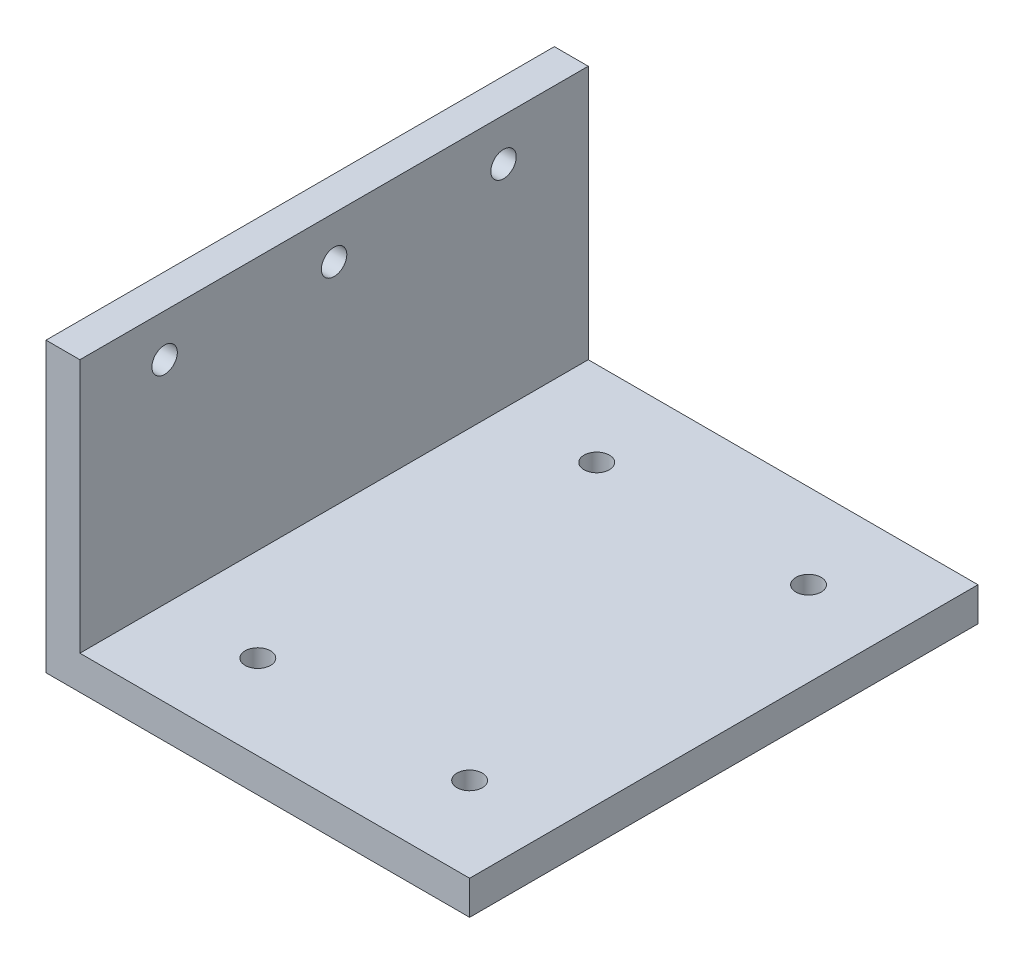
ISO-10303-21;
HEADER;
FILE_DESCRIPTION(('STEP AP214'),'2;1');
FILE_NAME('part.step','',(''),(''),'','','');
FILE_SCHEMA(('AUTOMOTIVE_DESIGN { 1 0 10303 214 1 1 1 1 }'));
ENDSEC;
DATA;
#1=APPLICATION_CONTEXT('core data for automotive mechanical design processes');
#2=APPLICATION_PROTOCOL_DEFINITION('international standard','automotive_design',2000,#1);
#3=PRODUCT_CONTEXT('',#1,'mechanical');
#4=PRODUCT('Part','Part','',(#3));
#5=PRODUCT_RELATED_PRODUCT_CATEGORY('part','',(#4));
#6=PRODUCT_DEFINITION_FORMATION('','',#4);
#7=PRODUCT_DEFINITION_CONTEXT('part definition',#1,'design');
#8=PRODUCT_DEFINITION('design','',#6,#7);
#9=PRODUCT_DEFINITION_SHAPE('','',#8);
#10=(LENGTH_UNIT() NAMED_UNIT(*) SI_UNIT(.MILLI.,.METRE.));
#11=(NAMED_UNIT(*) PLANE_ANGLE_UNIT() SI_UNIT($,.RADIAN.));
#12=(NAMED_UNIT(*) SI_UNIT($,.STERADIAN.) SOLID_ANGLE_UNIT());
#13=UNCERTAINTY_MEASURE_WITH_UNIT(LENGTH_MEASURE(1.E-05),#10,'distance_accuracy_value','');
#14=(GEOMETRIC_REPRESENTATION_CONTEXT(3) GLOBAL_UNCERTAINTY_ASSIGNED_CONTEXT((#13)) GLOBAL_UNIT_ASSIGNED_CONTEXT((#10,
#11,#12)) REPRESENTATION_CONTEXT('',''));
#15=CARTESIAN_POINT('',(0.,0.,0.));
#16=DIRECTION('',(0.,0.,1.));
#17=DIRECTION('',(1.,0.,0.));
#18=AXIS2_PLACEMENT_3D('',#15,#16,#17);
#19=CARTESIAN_POINT('',(0.,0.,60.));
#20=DIRECTION('',(1.,0.,0.));
#21=DIRECTION('',(0.,0.,-1.));
#22=AXIS2_PLACEMENT_3D('',#19,#20,#21);
#23=PLANE('',#22);
#24=CARTESIAN_POINT('',(0.,29.,30.));
#25=DIRECTION('',(-1.,0.,0.));
#26=DIRECTION('',(0.,0.,1.));
#27=AXIS2_PLACEMENT_3D('',#24,#25,#26);
#28=CIRCLE('',#27,1.5);
#29=CARTESIAN_POINT('',(0.,29.,31.5));
#30=VERTEX_POINT('',#29);
#31=EDGE_CURVE('E221',#30,#30,#28,.T.);
#32=ORIENTED_EDGE('',*,*,#31,.F.);
#33=EDGE_LOOP('',(#32));
#34=FACE_BOUND('',#33,.T.);
#35=CARTESIAN_POINT('',(0.,29.,50.));
#36=DIRECTION('',(-1.,0.,0.));
#37=DIRECTION('',(0.,0.,1.));
#38=AXIS2_PLACEMENT_3D('',#35,#36,#37);
#39=CIRCLE('',#38,1.5);
#40=CARTESIAN_POINT('',(0.,29.,51.5));
#41=VERTEX_POINT('',#40);
#42=EDGE_CURVE('E148',#41,#41,#39,.T.);
#43=ORIENTED_EDGE('',*,*,#42,.F.);
#44=EDGE_LOOP('',(#43));
#45=FACE_BOUND('',#44,.T.);
#46=DIRECTION('',(0.,-1.,0.));
#47=VECTOR('',#46,1.);
#48=CARTESIAN_POINT('',(0.,0.,60.));
#49=LINE('',#48,#47);
#50=CARTESIAN_POINT('',(0.,34.,60.));
#51=VERTEX_POINT('',#50);
#52=CARTESIAN_POINT('',(0.,0.,60.));
#53=VERTEX_POINT('',#52);
#54=EDGE_CURVE('E83',#51,#53,#49,.T.);
#55=ORIENTED_EDGE('',*,*,#54,.F.);
#56=DIRECTION('',(0.,0.,1.));
#57=VECTOR('',#56,1.);
#58=CARTESIAN_POINT('',(0.,34.,-24.0737136249027));
#59=LINE('',#58,#57);
#60=CARTESIAN_POINT('',(0.,34.,0.));
#61=VERTEX_POINT('',#60);
#62=EDGE_CURVE('E94',#61,#51,#59,.T.);
#63=ORIENTED_EDGE('',*,*,#62,.F.);
#64=DIRECTION('',(0.,-1.,0.));
#65=VECTOR('',#64,1.);
#66=CARTESIAN_POINT('',(0.,0.,0.));
#67=LINE('',#66,#65);
#68=CARTESIAN_POINT('',(0.,0.,0.));
#69=VERTEX_POINT('',#68);
#70=EDGE_CURVE('E104',#61,#69,#67,.T.);
#71=ORIENTED_EDGE('',*,*,#70,.T.);
#72=DIRECTION('',(0.,0.,-1.));
#73=VECTOR('',#72,1.);
#74=CARTESIAN_POINT('',(0.,0.,60.));
#75=LINE('',#74,#73);
#76=EDGE_CURVE('E134',#53,#69,#75,.T.);
#77=ORIENTED_EDGE('',*,*,#76,.F.);
#78=EDGE_LOOP('',(#55,#63,#71,#77));
#79=FACE_BOUND('',#78,.T.);
#80=CARTESIAN_POINT('',(0.,29.,9.99999999999999));
#81=DIRECTION('',(-1.,0.,0.));
#82=DIRECTION('',(0.,0.,1.));
#83=AXIS2_PLACEMENT_3D('',#80,#81,#82);
#84=CIRCLE('',#83,1.5);
#85=CARTESIAN_POINT('',(0.,29.,11.5));
#86=VERTEX_POINT('',#85);
#87=EDGE_CURVE('E39',#86,#86,#84,.T.);
#88=ORIENTED_EDGE('',*,*,#87,.F.);
#89=EDGE_LOOP('',(#88));
#90=FACE_BOUND('',#89,.T.);
#91=ADVANCED_FACE('F31',(#34,#45,#79,#90),#23,.F.);
#92=CARTESIAN_POINT('',(4.,0.,60.));
#93=DIRECTION('',(0.,1.,0.));
#94=DIRECTION('',(0.,0.,1.));
#95=AXIS2_PLACEMENT_3D('',#92,#93,#94);
#96=PLANE('',#95);
#97=CARTESIAN_POINT('',(40.,0.,9.99999999999999));
#98=DIRECTION('',(0.,1.,0.));
#99=DIRECTION('',(0.,0.,1.));
#100=AXIS2_PLACEMENT_3D('',#97,#98,#99);
#101=CIRCLE('',#100,1.5);
#102=CARTESIAN_POINT('',(40.,0.,11.5));
#103=VERTEX_POINT('',#102);
#104=EDGE_CURVE('E233',#103,#103,#101,.T.);
#105=ORIENTED_EDGE('',*,*,#104,.T.);
#106=EDGE_LOOP('',(#105));
#107=FACE_BOUND('',#106,.T.);
#108=CARTESIAN_POINT('',(40.,0.,50.));
#109=DIRECTION('',(0.,1.,0.));
#110=DIRECTION('',(0.,0.,1.));
#111=AXIS2_PLACEMENT_3D('',#108,#109,#110);
#112=CIRCLE('',#111,1.5);
#113=CARTESIAN_POINT('',(40.,0.,51.5));
#114=VERTEX_POINT('',#113);
#115=EDGE_CURVE('E112',#114,#114,#112,.T.);
#116=ORIENTED_EDGE('',*,*,#115,.T.);
#117=EDGE_LOOP('',(#116));
#118=FACE_BOUND('',#117,.T.);
#119=DIRECTION('',(1.,0.,0.));
#120=VECTOR('',#119,1.);
#121=CARTESIAN_POINT('',(4.,0.,0.));
#122=LINE('',#121,#120);
#123=CARTESIAN_POINT('',(50.,0.,0.));
#124=VERTEX_POINT('',#123);
#125=EDGE_CURVE('E110',#69,#124,#122,.T.);
#126=ORIENTED_EDGE('',*,*,#125,.T.);
#127=DIRECTION('',(0.,0.,-1.));
#128=VECTOR('',#127,1.);
#129=CARTESIAN_POINT('',(50.,0.,60.));
#130=LINE('',#129,#128);
#131=CARTESIAN_POINT('',(50.,0.,60.));
#132=VERTEX_POINT('',#131);
#133=EDGE_CURVE('E131',#132,#124,#130,.T.);
#134=ORIENTED_EDGE('',*,*,#133,.F.);
#135=DIRECTION('',(1.,0.,0.));
#136=VECTOR('',#135,1.);
#137=CARTESIAN_POINT('',(0.,0.,60.));
#138=LINE('',#137,#136);
#139=EDGE_CURVE('E242',#53,#132,#138,.T.);
#140=ORIENTED_EDGE('',*,*,#139,.F.);
#141=ORIENTED_EDGE('',*,*,#76,.T.);
#142=EDGE_LOOP('',(#126,#134,#140,#141));
#143=FACE_BOUND('',#142,.T.);
#144=CARTESIAN_POINT('',(15.,0.,50.));
#145=DIRECTION('',(0.,1.,0.));
#146=DIRECTION('',(0.,0.,1.));
#147=AXIS2_PLACEMENT_3D('',#144,#145,#146);
#148=CIRCLE('',#147,1.5);
#149=CARTESIAN_POINT('',(15.,0.,51.5));
#150=VERTEX_POINT('',#149);
#151=EDGE_CURVE('E136',#150,#150,#148,.T.);
#152=ORIENTED_EDGE('',*,*,#151,.T.);
#153=EDGE_LOOP('',(#152));
#154=FACE_BOUND('',#153,.T.);
#155=CARTESIAN_POINT('',(15.,0.,9.99999999999999));
#156=DIRECTION('',(0.,1.,0.));
#157=DIRECTION('',(0.,0.,1.));
#158=AXIS2_PLACEMENT_3D('',#155,#156,#157);
#159=CIRCLE('',#158,1.5);
#160=CARTESIAN_POINT('',(15.,0.,11.5));
#161=VERTEX_POINT('',#160);
#162=EDGE_CURVE('E142',#161,#161,#159,.T.);
#163=ORIENTED_EDGE('',*,*,#162,.T.);
#164=EDGE_LOOP('',(#163));
#165=FACE_BOUND('',#164,.T.);
#166=ADVANCED_FACE('F154',(#107,#118,#143,#154,#165),#96,.F.);
#167=CARTESIAN_POINT('',(50.,0.,60.));
#168=DIRECTION('',(-1.,0.,0.));
#169=DIRECTION('',(0.,0.,1.));
#170=AXIS2_PLACEMENT_3D('',#167,#168,#169);
#171=PLANE('',#170);
#172=DIRECTION('',(0.,1.,0.));
#173=VECTOR('',#172,1.);
#174=CARTESIAN_POINT('',(50.,0.,0.));
#175=LINE('',#174,#173);
#176=CARTESIAN_POINT('',(50.,4.,0.));
#177=VERTEX_POINT('',#176);
#178=EDGE_CURVE('E114',#124,#177,#175,.T.);
#179=ORIENTED_EDGE('',*,*,#178,.T.);
#180=DIRECTION('',(0.,0.,-1.));
#181=VECTOR('',#180,1.);
#182=CARTESIAN_POINT('',(50.,4.,60.));
#183=LINE('',#182,#181);
#184=CARTESIAN_POINT('',(50.,4.,60.));
#185=VERTEX_POINT('',#184);
#186=EDGE_CURVE('E129',#185,#177,#183,.T.);
#187=ORIENTED_EDGE('',*,*,#186,.F.);
#188=DIRECTION('',(0.,1.,0.));
#189=VECTOR('',#188,1.);
#190=CARTESIAN_POINT('',(50.,0.,60.));
#191=LINE('',#190,#189);
#192=EDGE_CURVE('E244',#132,#185,#191,.T.);
#193=ORIENTED_EDGE('',*,*,#192,.F.);
#194=ORIENTED_EDGE('',*,*,#133,.T.);
#195=EDGE_LOOP('',(#179,#187,#193,#194));
#196=FACE_BOUND('',#195,.T.);
#197=ADVANCED_FACE('F160',(#196),#171,.F.);
#198=CARTESIAN_POINT('',(4.,4.,60.));
#199=DIRECTION('',(0.,-1.,0.));
#200=DIRECTION('',(0.,0.,-1.));
#201=AXIS2_PLACEMENT_3D('',#198,#199,#200);
#202=PLANE('',#201);
#203=CARTESIAN_POINT('',(40.,4.,9.99999999999999));
#204=DIRECTION('',(0.,1.,0.));
#205=DIRECTION('',(0.,0.,1.));
#206=AXIS2_PLACEMENT_3D('',#203,#204,#205);
#207=CIRCLE('',#206,1.5);
#208=CARTESIAN_POINT('',(40.,4.,11.5));
#209=VERTEX_POINT('',#208);
#210=EDGE_CURVE('E236',#209,#209,#207,.T.);
#211=ORIENTED_EDGE('',*,*,#210,.F.);
#212=EDGE_LOOP('',(#211));
#213=FACE_BOUND('',#212,.T.);
#214=CARTESIAN_POINT('',(40.,4.,50.));
#215=DIRECTION('',(0.,1.,0.));
#216=DIRECTION('',(0.,0.,1.));
#217=AXIS2_PLACEMENT_3D('',#214,#215,#216);
#218=CIRCLE('',#217,1.5);
#219=CARTESIAN_POINT('',(40.,4.,51.5));
#220=VERTEX_POINT('',#219);
#221=EDGE_CURVE('E117',#220,#220,#218,.T.);
#222=ORIENTED_EDGE('',*,*,#221,.F.);
#223=EDGE_LOOP('',(#222));
#224=FACE_BOUND('',#223,.T.);
#225=DIRECTION('',(-1.,0.,0.));
#226=VECTOR('',#225,1.);
#227=CARTESIAN_POINT('',(4.,4.,0.));
#228=LINE('',#227,#226);
#229=CARTESIAN_POINT('',(4.,4.,0.));
#230=VERTEX_POINT('',#229);
#231=EDGE_CURVE('E76',#177,#230,#228,.T.);
#232=ORIENTED_EDGE('',*,*,#231,.T.);
#233=DIRECTION('',(0.,0.,-1.));
#234=VECTOR('',#233,1.);
#235=CARTESIAN_POINT('',(4.,4.,60.));
#236=LINE('',#235,#234);
#237=CARTESIAN_POINT('',(4.,4.,60.));
#238=VERTEX_POINT('',#237);
#239=EDGE_CURVE('E127',#238,#230,#236,.T.);
#240=ORIENTED_EDGE('',*,*,#239,.F.);
#241=DIRECTION('',(-1.,0.,0.));
#242=VECTOR('',#241,1.);
#243=CARTESIAN_POINT('',(4.,4.,60.));
#244=LINE('',#243,#242);
#245=EDGE_CURVE('E55',#185,#238,#244,.T.);
#246=ORIENTED_EDGE('',*,*,#245,.F.);
#247=ORIENTED_EDGE('',*,*,#186,.T.);
#248=EDGE_LOOP('',(#232,#240,#246,#247));
#249=FACE_BOUND('',#248,.T.);
#250=CARTESIAN_POINT('',(15.,4.,50.));
#251=DIRECTION('',(0.,1.,0.));
#252=DIRECTION('',(0.,0.,1.));
#253=AXIS2_PLACEMENT_3D('',#250,#251,#252);
#254=CIRCLE('',#253,1.5);
#255=CARTESIAN_POINT('',(15.,4.,51.5));
#256=VERTEX_POINT('',#255);
#257=EDGE_CURVE('E139',#256,#256,#254,.T.);
#258=ORIENTED_EDGE('',*,*,#257,.F.);
#259=EDGE_LOOP('',(#258));
#260=FACE_BOUND('',#259,.T.);
#261=CARTESIAN_POINT('',(15.,4.,9.99999999999999));
#262=DIRECTION('',(0.,1.,0.));
#263=DIRECTION('',(0.,0.,1.));
#264=AXIS2_PLACEMENT_3D('',#261,#262,#263);
#265=CIRCLE('',#264,1.5);
#266=CARTESIAN_POINT('',(15.,4.,11.5));
#267=VERTEX_POINT('',#266);
#268=EDGE_CURVE('E99',#267,#267,#265,.T.);
#269=ORIENTED_EDGE('',*,*,#268,.F.);
#270=EDGE_LOOP('',(#269));
#271=FACE_BOUND('',#270,.T.);
#272=ADVANCED_FACE('F183',(#213,#224,#249,#260,#271),#202,.F.);
#273=CARTESIAN_POINT('',(4.,4.,60.));
#274=DIRECTION('',(-1.,0.,0.));
#275=DIRECTION('',(0.,0.,1.));
#276=AXIS2_PLACEMENT_3D('',#273,#274,#275);
#277=PLANE('',#276);
#278=CARTESIAN_POINT('',(4.,29.,30.));
#279=DIRECTION('',(-1.,0.,0.));
#280=DIRECTION('',(0.,0.,1.));
#281=AXIS2_PLACEMENT_3D('',#278,#279,#280);
#282=CIRCLE('',#281,1.5);
#283=CARTESIAN_POINT('',(4.,29.,31.5));
#284=VERTEX_POINT('',#283);
#285=EDGE_CURVE('E224',#284,#284,#282,.T.);
#286=ORIENTED_EDGE('',*,*,#285,.T.);
#287=EDGE_LOOP('',(#286));
#288=FACE_BOUND('',#287,.T.);
#289=CARTESIAN_POINT('',(4.,29.,50.));
#290=DIRECTION('',(-1.,0.,0.));
#291=DIRECTION('',(0.,0.,1.));
#292=AXIS2_PLACEMENT_3D('',#289,#290,#291);
#293=CIRCLE('',#292,1.5);
#294=CARTESIAN_POINT('',(4.,29.,51.5));
#295=VERTEX_POINT('',#294);
#296=EDGE_CURVE('E106',#295,#295,#293,.T.);
#297=ORIENTED_EDGE('',*,*,#296,.T.);
#298=EDGE_LOOP('',(#297));
#299=FACE_BOUND('',#298,.T.);
#300=DIRECTION('',(0.,1.,0.));
#301=VECTOR('',#300,1.);
#302=CARTESIAN_POINT('',(4.,4.,0.));
#303=LINE('',#302,#301);
#304=CARTESIAN_POINT('',(4.,34.,0.));
#305=VERTEX_POINT('',#304);
#306=EDGE_CURVE('E125',#230,#305,#303,.T.);
#307=ORIENTED_EDGE('',*,*,#306,.T.);
#308=DIRECTION('',(0.,0.,1.));
#309=VECTOR('',#308,1.);
#310=CARTESIAN_POINT('',(4.,34.,60.));
#311=LINE('',#310,#309);
#312=CARTESIAN_POINT('',(4.,34.,60.));
#313=VERTEX_POINT('',#312);
#314=EDGE_CURVE('E46',#305,#313,#311,.T.);
#315=ORIENTED_EDGE('',*,*,#314,.T.);
#316=DIRECTION('',(0.,1.,0.));
#317=VECTOR('',#316,1.);
#318=CARTESIAN_POINT('',(4.,4.,60.));
#319=LINE('',#318,#317);
#320=EDGE_CURVE('E120',#238,#313,#319,.T.);
#321=ORIENTED_EDGE('',*,*,#320,.F.);
#322=ORIENTED_EDGE('',*,*,#239,.T.);
#323=EDGE_LOOP('',(#307,#315,#321,#322));
#324=FACE_BOUND('',#323,.T.);
#325=CARTESIAN_POINT('',(4.,29.,9.99999999999999));
#326=DIRECTION('',(-1.,0.,0.));
#327=DIRECTION('',(0.,0.,1.));
#328=AXIS2_PLACEMENT_3D('',#325,#326,#327);
#329=CIRCLE('',#328,1.5);
#330=CARTESIAN_POINT('',(4.,29.,11.5));
#331=VERTEX_POINT('',#330);
#332=EDGE_CURVE('E11',#331,#331,#329,.T.);
#333=ORIENTED_EDGE('',*,*,#332,.T.);
#334=EDGE_LOOP('',(#333));
#335=FACE_BOUND('',#334,.T.);
#336=ADVANCED_FACE('F185',(#288,#299,#324,#335),#277,.F.);
#337=CARTESIAN_POINT('',(0.,50.,60.));
#338=DIRECTION('',(0.,0.,-1.));
#339=DIRECTION('',(-1.,0.,0.));
#340=AXIS2_PLACEMENT_3D('',#337,#338,#339);
#341=PLANE('',#340);
#342=ORIENTED_EDGE('',*,*,#320,.T.);
#343=DIRECTION('',(-1.,0.,0.));
#344=VECTOR('',#343,1.);
#345=CARTESIAN_POINT('',(0.,34.,60.));
#346=LINE('',#345,#344);
#347=EDGE_CURVE('E231',#313,#51,#346,.T.);
#348=ORIENTED_EDGE('',*,*,#347,.T.);
#349=ORIENTED_EDGE('',*,*,#54,.T.);
#350=ORIENTED_EDGE('',*,*,#139,.T.);
#351=ORIENTED_EDGE('',*,*,#192,.T.);
#352=ORIENTED_EDGE('',*,*,#245,.T.);
#353=EDGE_LOOP('',(#342,#348,#349,#350,#351,#352));
#354=FACE_BOUND('',#353,.T.);
#355=ADVANCED_FACE('F192',(#354),#341,.F.);
#356=CARTESIAN_POINT('',(0.,50.,0.));
#357=DIRECTION('',(0.,0.,-1.));
#358=DIRECTION('',(-1.,0.,0.));
#359=AXIS2_PLACEMENT_3D('',#356,#357,#358);
#360=PLANE('',#359);
#361=DIRECTION('',(-1.,0.,0.));
#362=VECTOR('',#361,1.);
#363=CARTESIAN_POINT('',(0.,34.,0.));
#364=LINE('',#363,#362);
#365=EDGE_CURVE('E91',#305,#61,#364,.T.);
#366=ORIENTED_EDGE('',*,*,#365,.F.);
#367=ORIENTED_EDGE('',*,*,#306,.F.);
#368=ORIENTED_EDGE('',*,*,#231,.F.);
#369=ORIENTED_EDGE('',*,*,#178,.F.);
#370=ORIENTED_EDGE('',*,*,#125,.F.);
#371=ORIENTED_EDGE('',*,*,#70,.F.);
#372=EDGE_LOOP('',(#366,#367,#368,#369,#370,#371));
#373=FACE_BOUND('',#372,.T.);
#374=ADVANCED_FACE('F108',(#373),#360,.T.);
#375=CARTESIAN_POINT('',(40.,0.,50.));
#376=DIRECTION('',(0.,1.,0.));
#377=DIRECTION('',(0.,0.,1.));
#378=AXIS2_PLACEMENT_3D('',#375,#376,#377);
#379=CYLINDRICAL_SURFACE('',#378,1.5);
#380=ORIENTED_EDGE('',*,*,#115,.F.);
#381=EDGE_LOOP('',(#380));
#382=FACE_BOUND('',#381,.T.);
#383=ORIENTED_EDGE('',*,*,#221,.T.);
#384=EDGE_LOOP('',(#383));
#385=FACE_BOUND('',#384,.T.);
#386=ADVANCED_FACE('F201',(#382,#385),#379,.F.);
#387=CARTESIAN_POINT('',(40.,0.,9.99999999999999));
#388=DIRECTION('',(0.,1.,0.));
#389=DIRECTION('',(0.,0.,1.));
#390=AXIS2_PLACEMENT_3D('',#387,#388,#389);
#391=CYLINDRICAL_SURFACE('',#390,1.5);
#392=ORIENTED_EDGE('',*,*,#104,.F.);
#393=EDGE_LOOP('',(#392));
#394=FACE_BOUND('',#393,.T.);
#395=ORIENTED_EDGE('',*,*,#210,.T.);
#396=EDGE_LOOP('',(#395));
#397=FACE_BOUND('',#396,.T.);
#398=ADVANCED_FACE('F170',(#394,#397),#391,.F.);
#399=CARTESIAN_POINT('',(15.,0.,50.));
#400=DIRECTION('',(0.,1.,0.));
#401=DIRECTION('',(0.,0.,1.));
#402=AXIS2_PLACEMENT_3D('',#399,#400,#401);
#403=CYLINDRICAL_SURFACE('',#402,1.5);
#404=ORIENTED_EDGE('',*,*,#151,.F.);
#405=EDGE_LOOP('',(#404));
#406=FACE_BOUND('',#405,.T.);
#407=ORIENTED_EDGE('',*,*,#257,.T.);
#408=EDGE_LOOP('',(#407));
#409=FACE_BOUND('',#408,.T.);
#410=ADVANCED_FACE('F167',(#406,#409),#403,.F.);
#411=CARTESIAN_POINT('',(15.,0.,9.99999999999999));
#412=DIRECTION('',(0.,1.,0.));
#413=DIRECTION('',(0.,0.,1.));
#414=AXIS2_PLACEMENT_3D('',#411,#412,#413);
#415=CYLINDRICAL_SURFACE('',#414,1.5);
#416=ORIENTED_EDGE('',*,*,#162,.F.);
#417=EDGE_LOOP('',(#416));
#418=FACE_BOUND('',#417,.T.);
#419=ORIENTED_EDGE('',*,*,#268,.T.);
#420=EDGE_LOOP('',(#419));
#421=FACE_BOUND('',#420,.T.);
#422=ADVANCED_FACE('F169',(#418,#421),#415,.F.);
#423=CARTESIAN_POINT('',(10.,34.,-24.0737136249027));
#424=DIRECTION('',(0.,-1.,0.));
#425=DIRECTION('',(0.,0.,-1.));
#426=AXIS2_PLACEMENT_3D('',#423,#424,#425);
#427=PLANE('',#426);
#428=ORIENTED_EDGE('',*,*,#314,.F.);
#429=ORIENTED_EDGE('',*,*,#365,.T.);
#430=ORIENTED_EDGE('',*,*,#62,.T.);
#431=ORIENTED_EDGE('',*,*,#347,.F.);
#432=EDGE_LOOP('',(#428,#429,#430,#431));
#433=FACE_BOUND('',#432,.T.);
#434=ADVANCED_FACE('F93',(#433),#427,.F.);
#435=CARTESIAN_POINT('',(10.,29.,50.));
#436=DIRECTION('',(-1.,0.,0.));
#437=DIRECTION('',(0.,0.,1.));
#438=AXIS2_PLACEMENT_3D('',#435,#436,#437);
#439=CYLINDRICAL_SURFACE('',#438,1.5);
#440=ORIENTED_EDGE('',*,*,#42,.T.);
#441=EDGE_LOOP('',(#440));
#442=FACE_BOUND('',#441,.T.);
#443=ORIENTED_EDGE('',*,*,#296,.F.);
#444=EDGE_LOOP('',(#443));
#445=FACE_BOUND('',#444,.T.);
#446=ADVANCED_FACE('F177',(#442,#445),#439,.F.);
#447=CARTESIAN_POINT('',(10.,29.,30.));
#448=DIRECTION('',(-1.,0.,0.));
#449=DIRECTION('',(0.,0.,1.));
#450=AXIS2_PLACEMENT_3D('',#447,#448,#449);
#451=CYLINDRICAL_SURFACE('',#450,1.5);
#452=ORIENTED_EDGE('',*,*,#31,.T.);
#453=EDGE_LOOP('',(#452));
#454=FACE_BOUND('',#453,.T.);
#455=ORIENTED_EDGE('',*,*,#285,.F.);
#456=EDGE_LOOP('',(#455));
#457=FACE_BOUND('',#456,.T.);
#458=ADVANCED_FACE('F212',(#454,#457),#451,.F.);
#459=CARTESIAN_POINT('',(10.,29.,9.99999999999999));
#460=DIRECTION('',(-1.,0.,0.));
#461=DIRECTION('',(0.,0.,1.));
#462=AXIS2_PLACEMENT_3D('',#459,#460,#461);
#463=CYLINDRICAL_SURFACE('',#462,1.5);
#464=ORIENTED_EDGE('',*,*,#87,.T.);
#465=EDGE_LOOP('',(#464));
#466=FACE_BOUND('',#465,.T.);
#467=ORIENTED_EDGE('',*,*,#332,.F.);
#468=EDGE_LOOP('',(#467));
#469=FACE_BOUND('',#468,.T.);
#470=ADVANCED_FACE('F33',(#466,#469),#463,.F.);
#471=CLOSED_SHELL('',(#91,#166,#197,#272,#336,#355,#374,#386,#398,#410,#422,#434,#446,#458,#470));
#472=MANIFOLD_SOLID_BREP('B2',#471);
#473=ADVANCED_BREP_SHAPE_REPRESENTATION('',(#18,#472),#14);
#474=SHAPE_DEFINITION_REPRESENTATION(#9,#473);
ENDSEC;
END-ISO-10303-21;
